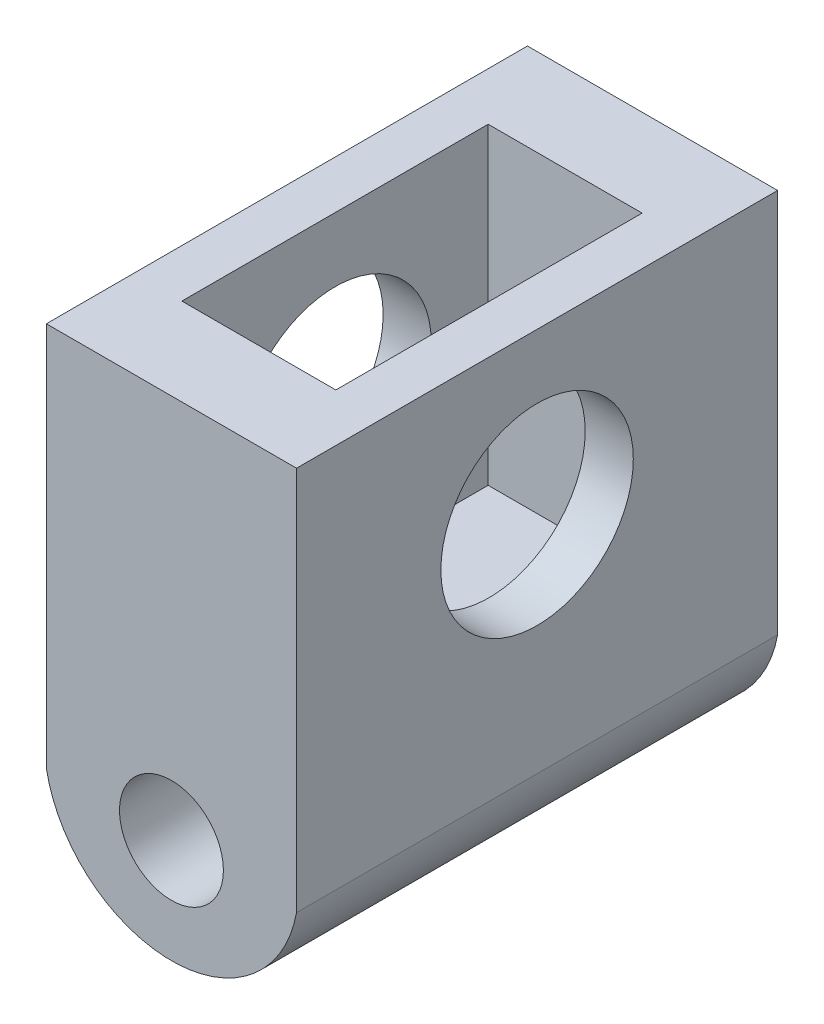
ISO-10303-21;
HEADER;
FILE_DESCRIPTION(('STEP AP214'),'2;1');
FILE_NAME('part.step','',(''),(''),'','','');
FILE_SCHEMA(('AUTOMOTIVE_DESIGN { 1 0 10303 214 1 1 1 1 }'));
ENDSEC;
DATA;
#1=APPLICATION_CONTEXT('core data for automotive mechanical design processes');
#2=APPLICATION_PROTOCOL_DEFINITION('international standard','automotive_design',2000,#1);
#3=PRODUCT_CONTEXT('',#1,'mechanical');
#4=PRODUCT('Part','Part','',(#3));
#5=PRODUCT_RELATED_PRODUCT_CATEGORY('part','',(#4));
#6=PRODUCT_DEFINITION_FORMATION('','',#4);
#7=PRODUCT_DEFINITION_CONTEXT('part definition',#1,'design');
#8=PRODUCT_DEFINITION('design','',#6,#7);
#9=PRODUCT_DEFINITION_SHAPE('','',#8);
#10=(LENGTH_UNIT() NAMED_UNIT(*) SI_UNIT(.MILLI.,.METRE.));
#11=(NAMED_UNIT(*) PLANE_ANGLE_UNIT() SI_UNIT($,.RADIAN.));
#12=(NAMED_UNIT(*) SI_UNIT($,.STERADIAN.) SOLID_ANGLE_UNIT());
#13=UNCERTAINTY_MEASURE_WITH_UNIT(LENGTH_MEASURE(1.E-05),#10,'distance_accuracy_value','');
#14=(GEOMETRIC_REPRESENTATION_CONTEXT(3) GLOBAL_UNCERTAINTY_ASSIGNED_CONTEXT((#13)) GLOBAL_UNIT_ASSIGNED_CONTEXT((#10,
#11,#12)) REPRESENTATION_CONTEXT('',''));
#15=CARTESIAN_POINT('',(0.,0.,0.));
#16=DIRECTION('',(0.,0.,1.));
#17=DIRECTION('',(1.,0.,0.));
#18=AXIS2_PLACEMENT_3D('',#15,#16,#17);
#19=CARTESIAN_POINT('',(0.,1.43,-15.));
#20=DIRECTION('',(0.,0.,1.));
#21=DIRECTION('',(1.,0.,0.));
#22=AXIS2_PLACEMENT_3D('',#19,#20,#21);
#23=CYLINDRICAL_SURFACE('',#22,7.93);
#24=DIRECTION('',(0.,0.,1.));
#25=VECTOR('',#24,1.);
#26=CARTESIAN_POINT('',(7.8,0.,-15.));
#27=LINE('',#26,#25);
#28=CARTESIAN_POINT('',(7.8,0.,-15.));
#29=VERTEX_POINT('',#28);
#30=CARTESIAN_POINT('',(7.8,0.,15.));
#31=VERTEX_POINT('',#30);
#32=EDGE_CURVE('E189',#29,#31,#27,.T.);
#33=ORIENTED_EDGE('',*,*,#32,.T.);
#34=CARTESIAN_POINT('',(0.,1.43,15.));
#35=DIRECTION('',(0.,0.,1.));
#36=DIRECTION('',(-1.,0.,0.));
#37=AXIS2_PLACEMENT_3D('',#34,#35,#36);
#38=CIRCLE('',#37,7.93);
#39=CARTESIAN_POINT('',(-7.8,0.,15.));
#40=VERTEX_POINT('',#39);
#41=EDGE_CURVE('E155',#40,#31,#38,.T.);
#42=ORIENTED_EDGE('',*,*,#41,.F.);
#43=DIRECTION('',(0.,0.,1.));
#44=VECTOR('',#43,1.);
#45=CARTESIAN_POINT('',(-7.8,0.,-15.));
#46=LINE('',#45,#44);
#47=CARTESIAN_POINT('',(-7.8,0.,-15.));
#48=VERTEX_POINT('',#47);
#49=EDGE_CURVE('E12',#48,#40,#46,.T.);
#50=ORIENTED_EDGE('',*,*,#49,.F.);
#51=CARTESIAN_POINT('',(0.,1.43,-15.));
#52=DIRECTION('',(0.,0.,1.));
#53=DIRECTION('',(-1.,0.,0.));
#54=AXIS2_PLACEMENT_3D('',#51,#52,#53);
#55=CIRCLE('',#54,7.93);
#56=EDGE_CURVE('E175',#48,#29,#55,.T.);
#57=ORIENTED_EDGE('',*,*,#56,.T.);
#58=EDGE_LOOP('',(#33,#42,#50,#57));
#59=FACE_BOUND('',#58,.T.);
#60=ADVANCED_FACE('F41',(#59),#23,.T.);
#61=CARTESIAN_POINT('',(-7.8,0.,-15.));
#62=DIRECTION('',(-1.,0.,0.));
#63=DIRECTION('',(0.,0.,1.));
#64=AXIS2_PLACEMENT_3D('',#61,#62,#63);
#65=PLANE('',#64);
#66=CARTESIAN_POINT('',(-7.8,14.,0.));
#67=DIRECTION('',(-1.,0.,0.));
#68=DIRECTION('',(0.,0.,1.));
#69=AXIS2_PLACEMENT_3D('',#66,#67,#68);
#70=CIRCLE('',#69,6.);
#71=CARTESIAN_POINT('',(-7.8,14.,6.));
#72=VERTEX_POINT('',#71);
#73=EDGE_CURVE('E346',#72,#72,#70,.T.);
#74=ORIENTED_EDGE('',*,*,#73,.F.);
#75=EDGE_LOOP('',(#74));
#76=FACE_BOUND('',#75,.T.);
#77=ORIENTED_EDGE('',*,*,#49,.T.);
#78=DIRECTION('',(0.,-1.,0.));
#79=VECTOR('',#78,1.);
#80=CARTESIAN_POINT('',(-7.8,0.,15.));
#81=LINE('',#80,#79);
#82=CARTESIAN_POINT('',(-7.8,24.,15.));
#83=VERTEX_POINT('',#82);
#84=EDGE_CURVE('E167',#83,#40,#81,.T.);
#85=ORIENTED_EDGE('',*,*,#84,.F.);
#86=DIRECTION('',(0.,0.,1.));
#87=VECTOR('',#86,1.);
#88=CARTESIAN_POINT('',(-7.8,24.,-15.));
#89=LINE('',#88,#87);
#90=CARTESIAN_POINT('',(-7.8,24.,-15.));
#91=VERTEX_POINT('',#90);
#92=EDGE_CURVE('E50',#91,#83,#89,.T.);
#93=ORIENTED_EDGE('',*,*,#92,.F.);
#94=DIRECTION('',(0.,-1.,0.));
#95=VECTOR('',#94,1.);
#96=CARTESIAN_POINT('',(-7.8,0.,-15.));
#97=LINE('',#96,#95);
#98=EDGE_CURVE('E186',#91,#48,#97,.T.);
#99=ORIENTED_EDGE('',*,*,#98,.T.);
#100=EDGE_LOOP('',(#77,#85,#93,#99));
#101=FACE_BOUND('',#100,.T.);
#102=ADVANCED_FACE('F206',(#76,#101),#65,.T.);
#103=CARTESIAN_POINT('',(-7.8,24.,-15.));
#104=DIRECTION('',(0.,1.,0.));
#105=DIRECTION('',(-1.,0.,0.));
#106=AXIS2_PLACEMENT_3D('',#103,#104,#105);
#107=PLANE('',#106);
#108=DIRECTION('',(-1.,0.,0.));
#109=VECTOR('',#108,1.);
#110=CARTESIAN_POINT('',(35.0957872207416,24.,9.55));
#111=LINE('',#110,#109);
#112=CARTESIAN_POINT('',(4.8,24.,9.55));
#113=VERTEX_POINT('',#112);
#114=CARTESIAN_POINT('',(-4.8,24.,9.55));
#115=VERTEX_POINT('',#114);
#116=EDGE_CURVE('E113',#113,#115,#111,.T.);
#117=ORIENTED_EDGE('',*,*,#116,.T.);
#118=DIRECTION('',(0.,0.,-1.));
#119=VECTOR('',#118,1.);
#120=CARTESIAN_POINT('',(-4.8,24.,-9.55));
#121=LINE('',#120,#119);
#122=CARTESIAN_POINT('',(-4.8,24.,-9.55));
#123=VERTEX_POINT('',#122);
#124=EDGE_CURVE('E129',#115,#123,#121,.T.);
#125=ORIENTED_EDGE('',*,*,#124,.T.);
#126=DIRECTION('',(-1.,0.,0.));
#127=VECTOR('',#126,1.);
#128=CARTESIAN_POINT('',(35.0957872207416,24.,-9.55));
#129=LINE('',#128,#127);
#130=CARTESIAN_POINT('',(4.8,24.,-9.55));
#131=VERTEX_POINT('',#130);
#132=EDGE_CURVE('E142',#131,#123,#129,.T.);
#133=ORIENTED_EDGE('',*,*,#132,.F.);
#134=DIRECTION('',(0.,0.,-1.));
#135=VECTOR('',#134,1.);
#136=CARTESIAN_POINT('',(4.8,24.,-9.55));
#137=LINE('',#136,#135);
#138=EDGE_CURVE('E58',#113,#131,#137,.T.);
#139=ORIENTED_EDGE('',*,*,#138,.F.);
#140=EDGE_LOOP('',(#117,#125,#133,#139));
#141=FACE_BOUND('',#140,.T.);
#142=ORIENTED_EDGE('',*,*,#92,.T.);
#143=DIRECTION('',(-1.,0.,0.));
#144=VECTOR('',#143,1.);
#145=CARTESIAN_POINT('',(-7.8,24.,15.));
#146=LINE('',#145,#144);
#147=CARTESIAN_POINT('',(7.8,24.,15.));
#148=VERTEX_POINT('',#147);
#149=EDGE_CURVE('E163',#148,#83,#146,.T.);
#150=ORIENTED_EDGE('',*,*,#149,.F.);
#151=DIRECTION('',(0.,0.,1.));
#152=VECTOR('',#151,1.);
#153=CARTESIAN_POINT('',(7.8,24.,-15.));
#154=LINE('',#153,#152);
#155=CARTESIAN_POINT('',(7.8,24.,-15.));
#156=VERTEX_POINT('',#155);
#157=EDGE_CURVE('E193',#156,#148,#154,.T.);
#158=ORIENTED_EDGE('',*,*,#157,.F.);
#159=DIRECTION('',(-1.,0.,0.));
#160=VECTOR('',#159,1.);
#161=CARTESIAN_POINT('',(-7.8,24.,-15.));
#162=LINE('',#161,#160);
#163=EDGE_CURVE('E182',#156,#91,#162,.T.);
#164=ORIENTED_EDGE('',*,*,#163,.T.);
#165=EDGE_LOOP('',(#142,#150,#158,#164));
#166=FACE_BOUND('',#165,.T.);
#167=ADVANCED_FACE('F212',(#141,#166),#107,.T.);
#168=CARTESIAN_POINT('',(7.8,0.,-15.));
#169=DIRECTION('',(1.,0.,0.));
#170=DIRECTION('',(0.,0.,-1.));
#171=AXIS2_PLACEMENT_3D('',#168,#169,#170);
#172=PLANE('',#171);
#173=CARTESIAN_POINT('',(7.8,14.,0.));
#174=DIRECTION('',(-1.,0.,0.));
#175=DIRECTION('',(0.,0.,1.));
#176=AXIS2_PLACEMENT_3D('',#173,#174,#175);
#177=CIRCLE('',#176,6.);
#178=CARTESIAN_POINT('',(7.8,14.,6.));
#179=VERTEX_POINT('',#178);
#180=EDGE_CURVE('E359',#179,#179,#177,.T.);
#181=ORIENTED_EDGE('',*,*,#180,.T.);
#182=EDGE_LOOP('',(#181));
#183=FACE_BOUND('',#182,.T.);
#184=ORIENTED_EDGE('',*,*,#157,.T.);
#185=DIRECTION('',(0.,1.,0.));
#186=VECTOR('',#185,1.);
#187=CARTESIAN_POINT('',(7.8,0.,15.));
#188=LINE('',#187,#186);
#189=EDGE_CURVE('E159',#31,#148,#188,.T.);
#190=ORIENTED_EDGE('',*,*,#189,.F.);
#191=ORIENTED_EDGE('',*,*,#32,.F.);
#192=DIRECTION('',(0.,1.,0.));
#193=VECTOR('',#192,1.);
#194=CARTESIAN_POINT('',(7.8,0.,-15.));
#195=LINE('',#194,#193);
#196=EDGE_CURVE('E178',#29,#156,#195,.T.);
#197=ORIENTED_EDGE('',*,*,#196,.T.);
#198=EDGE_LOOP('',(#184,#190,#191,#197));
#199=FACE_BOUND('',#198,.T.);
#200=ADVANCED_FACE('F199',(#183,#199),#172,.T.);
#201=CARTESIAN_POINT('',(0.,1.43,-15.));
#202=DIRECTION('',(0.,0.,-1.));
#203=DIRECTION('',(-1.,0.,0.));
#204=AXIS2_PLACEMENT_3D('',#201,#202,#203);
#205=PLANE('',#204);
#206=CARTESIAN_POINT('',(0.,0.,-15.));
#207=DIRECTION('',(0.,0.,1.));
#208=DIRECTION('',(1.,0.,0.));
#209=AXIS2_PLACEMENT_3D('',#206,#207,#208);
#210=CIRCLE('',#209,3.2385);
#211=CARTESIAN_POINT('',(3.2385,0.,-15.));
#212=VERTEX_POINT('',#211);
#213=EDGE_CURVE('E171',#212,#212,#210,.T.);
#214=ORIENTED_EDGE('',*,*,#213,.T.);
#215=EDGE_LOOP('',(#214));
#216=FACE_BOUND('',#215,.T.);
#217=ORIENTED_EDGE('',*,*,#56,.F.);
#218=ORIENTED_EDGE('',*,*,#98,.F.);
#219=ORIENTED_EDGE('',*,*,#163,.F.);
#220=ORIENTED_EDGE('',*,*,#196,.F.);
#221=EDGE_LOOP('',(#217,#218,#219,#220));
#222=FACE_BOUND('',#221,.T.);
#223=ADVANCED_FACE('F210',(#216,#222),#205,.T.);
#224=CARTESIAN_POINT('',(0.,0.,-15.));
#225=DIRECTION('',(0.,0.,1.));
#226=DIRECTION('',(1.,0.,0.));
#227=AXIS2_PLACEMENT_3D('',#224,#225,#226);
#228=CYLINDRICAL_SURFACE('',#227,3.2385);
#229=ORIENTED_EDGE('',*,*,#213,.F.);
#230=EDGE_LOOP('',(#229));
#231=FACE_BOUND('',#230,.T.);
#232=CARTESIAN_POINT('',(0.,0.,15.));
#233=DIRECTION('',(0.,0.,1.));
#234=DIRECTION('',(1.,0.,0.));
#235=AXIS2_PLACEMENT_3D('',#232,#233,#234);
#236=CIRCLE('',#235,3.2385);
#237=CARTESIAN_POINT('',(3.2385,0.,15.));
#238=VERTEX_POINT('',#237);
#239=EDGE_CURVE('E151',#238,#238,#236,.T.);
#240=ORIENTED_EDGE('',*,*,#239,.T.);
#241=EDGE_LOOP('',(#240));
#242=FACE_BOUND('',#241,.T.);
#243=ADVANCED_FACE('F301',(#231,#242),#228,.F.);
#244=CARTESIAN_POINT('',(0.,1.43,15.));
#245=DIRECTION('',(0.,0.,-1.));
#246=DIRECTION('',(-1.,0.,0.));
#247=AXIS2_PLACEMENT_3D('',#244,#245,#246);
#248=PLANE('',#247);
#249=ORIENTED_EDGE('',*,*,#41,.T.);
#250=ORIENTED_EDGE('',*,*,#189,.T.);
#251=ORIENTED_EDGE('',*,*,#149,.T.);
#252=ORIENTED_EDGE('',*,*,#84,.T.);
#253=EDGE_LOOP('',(#249,#250,#251,#252));
#254=FACE_BOUND('',#253,.T.);
#255=ORIENTED_EDGE('',*,*,#239,.F.);
#256=EDGE_LOOP('',(#255));
#257=FACE_BOUND('',#256,.T.);
#258=ADVANCED_FACE('F202',(#254,#257),#248,.F.);
#259=CARTESIAN_POINT('',(4.8,0.,-15.));
#260=DIRECTION('',(1.,0.,0.));
#261=DIRECTION('',(0.,0.,-1.));
#262=AXIS2_PLACEMENT_3D('',#259,#260,#261);
#263=PLANE('',#262);
#264=CARTESIAN_POINT('',(4.8,14.,0.));
#265=DIRECTION('',(1.,0.,0.));
#266=DIRECTION('',(0.,0.,-1.));
#267=AXIS2_PLACEMENT_3D('',#264,#265,#266);
#268=CIRCLE('',#267,6.);
#269=CARTESIAN_POINT('',(4.8,14.,-6.));
#270=VERTEX_POINT('',#269);
#271=EDGE_CURVE('E350',#270,#270,#268,.T.);
#272=ORIENTED_EDGE('',*,*,#271,.T.);
#273=EDGE_LOOP('',(#272));
#274=FACE_BOUND('',#273,.T.);
#275=DIRECTION('',(0.,-1.,0.));
#276=VECTOR('',#275,1.);
#277=CARTESIAN_POINT('',(4.8,24.,-9.55));
#278=LINE('',#277,#276);
#279=CARTESIAN_POINT('',(4.8,4.5,-9.55000000000001));
#280=VERTEX_POINT('',#279);
#281=EDGE_CURVE('E126',#131,#280,#278,.T.);
#282=ORIENTED_EDGE('',*,*,#281,.T.);
#283=DIRECTION('',(0.,0.,1.));
#284=VECTOR('',#283,1.);
#285=CARTESIAN_POINT('',(4.8,4.5,-9.55000000000001));
#286=LINE('',#285,#284);
#287=CARTESIAN_POINT('',(4.8,4.5,9.55));
#288=VERTEX_POINT('',#287);
#289=EDGE_CURVE('E120',#280,#288,#286,.T.);
#290=ORIENTED_EDGE('',*,*,#289,.T.);
#291=DIRECTION('',(0.,1.,0.));
#292=VECTOR('',#291,1.);
#293=CARTESIAN_POINT('',(4.8,24.,9.55));
#294=LINE('',#293,#292);
#295=EDGE_CURVE('E107',#288,#113,#294,.T.);
#296=ORIENTED_EDGE('',*,*,#295,.T.);
#297=ORIENTED_EDGE('',*,*,#138,.T.);
#298=EDGE_LOOP('',(#282,#290,#296,#297));
#299=FACE_BOUND('',#298,.T.);
#300=ADVANCED_FACE('F125',(#274,#299),#263,.F.);
#301=CARTESIAN_POINT('',(-4.8,0.,0.));
#302=DIRECTION('',(-1.,0.,0.));
#303=DIRECTION('',(0.,0.,1.));
#304=AXIS2_PLACEMENT_3D('',#301,#302,#303);
#305=PLANE('',#304);
#306=CARTESIAN_POINT('',(-4.8,14.,0.));
#307=DIRECTION('',(-1.,0.,0.));
#308=DIRECTION('',(0.,0.,1.));
#309=AXIS2_PLACEMENT_3D('',#306,#307,#308);
#310=CIRCLE('',#309,6.);
#311=CARTESIAN_POINT('',(-4.8,14.,6.));
#312=VERTEX_POINT('',#311);
#313=EDGE_CURVE('E44',#312,#312,#310,.T.);
#314=ORIENTED_EDGE('',*,*,#313,.T.);
#315=EDGE_LOOP('',(#314));
#316=FACE_BOUND('',#315,.T.);
#317=DIRECTION('',(0.,-1.,0.));
#318=VECTOR('',#317,1.);
#319=CARTESIAN_POINT('',(-4.8,24.,-9.55));
#320=LINE('',#319,#318);
#321=CARTESIAN_POINT('',(-4.8,4.5,-9.55000000000001));
#322=VERTEX_POINT('',#321);
#323=EDGE_CURVE('E137',#123,#322,#320,.T.);
#324=ORIENTED_EDGE('',*,*,#323,.F.);
#325=ORIENTED_EDGE('',*,*,#124,.F.);
#326=DIRECTION('',(0.,1.,0.));
#327=VECTOR('',#326,1.);
#328=CARTESIAN_POINT('',(-4.8,24.,9.55));
#329=LINE('',#328,#327);
#330=CARTESIAN_POINT('',(-4.8,4.5,9.55));
#331=VERTEX_POINT('',#330);
#332=EDGE_CURVE('E133',#331,#115,#329,.T.);
#333=ORIENTED_EDGE('',*,*,#332,.F.);
#334=DIRECTION('',(0.,0.,1.));
#335=VECTOR('',#334,1.);
#336=CARTESIAN_POINT('',(-4.8,4.5,-9.55000000000001));
#337=LINE('',#336,#335);
#338=EDGE_CURVE('E122',#322,#331,#337,.T.);
#339=ORIENTED_EDGE('',*,*,#338,.F.);
#340=EDGE_LOOP('',(#324,#325,#333,#339));
#341=FACE_BOUND('',#340,.T.);
#342=ADVANCED_FACE('F255',(#316,#341),#305,.F.);
#343=CARTESIAN_POINT('',(35.0957872207416,4.5,-9.55000000000001));
#344=DIRECTION('',(0.,-1.,0.));
#345=DIRECTION('',(0.,0.,-1.));
#346=AXIS2_PLACEMENT_3D('',#343,#344,#345);
#347=PLANE('',#346);
#348=DIRECTION('',(-1.,0.,0.));
#349=VECTOR('',#348,1.);
#350=CARTESIAN_POINT('',(35.0957872207416,4.5,-9.55000000000001));
#351=LINE('',#350,#349);
#352=EDGE_CURVE('E141',#280,#322,#351,.T.);
#353=ORIENTED_EDGE('',*,*,#352,.T.);
#354=ORIENTED_EDGE('',*,*,#338,.T.);
#355=DIRECTION('',(-1.,0.,0.));
#356=VECTOR('',#355,1.);
#357=CARTESIAN_POINT('',(35.0957872207416,4.5,9.55));
#358=LINE('',#357,#356);
#359=EDGE_CURVE('E110',#288,#331,#358,.T.);
#360=ORIENTED_EDGE('',*,*,#359,.F.);
#361=ORIENTED_EDGE('',*,*,#289,.F.);
#362=EDGE_LOOP('',(#353,#354,#360,#361));
#363=FACE_BOUND('',#362,.T.);
#364=ADVANCED_FACE('F119',(#363),#347,.F.);
#365=CARTESIAN_POINT('',(35.0957872207416,24.,9.55));
#366=DIRECTION('',(0.,0.,1.));
#367=DIRECTION('',(0.,-1.,0.));
#368=AXIS2_PLACEMENT_3D('',#365,#366,#367);
#369=PLANE('',#368);
#370=ORIENTED_EDGE('',*,*,#359,.T.);
#371=ORIENTED_EDGE('',*,*,#332,.T.);
#372=ORIENTED_EDGE('',*,*,#116,.F.);
#373=ORIENTED_EDGE('',*,*,#295,.F.);
#374=EDGE_LOOP('',(#370,#371,#372,#373));
#375=FACE_BOUND('',#374,.T.);
#376=ADVANCED_FACE('F109',(#375),#369,.F.);
#377=CARTESIAN_POINT('',(35.0957872207416,24.,-9.55));
#378=DIRECTION('',(0.,0.,-1.));
#379=DIRECTION('',(0.,1.,0.));
#380=AXIS2_PLACEMENT_3D('',#377,#378,#379);
#381=PLANE('',#380);
#382=ORIENTED_EDGE('',*,*,#132,.T.);
#383=ORIENTED_EDGE('',*,*,#323,.T.);
#384=ORIENTED_EDGE('',*,*,#352,.F.);
#385=ORIENTED_EDGE('',*,*,#281,.F.);
#386=EDGE_LOOP('',(#382,#383,#384,#385));
#387=FACE_BOUND('',#386,.T.);
#388=ADVANCED_FACE('F238',(#387),#381,.F.);
#389=CARTESIAN_POINT('',(7.8,14.,0.));
#390=DIRECTION('',(-1.,0.,0.));
#391=DIRECTION('',(0.,0.,1.));
#392=AXIS2_PLACEMENT_3D('',#389,#390,#391);
#393=CYLINDRICAL_SURFACE('',#392,6.);
#394=ORIENTED_EDGE('',*,*,#73,.T.);
#395=EDGE_LOOP('',(#394));
#396=FACE_BOUND('',#395,.T.);
#397=ORIENTED_EDGE('',*,*,#313,.F.);
#398=EDGE_LOOP('',(#397));
#399=FACE_BOUND('',#398,.T.);
#400=ADVANCED_FACE('F274',(#396,#399),#393,.F.);
#401=ORIENTED_EDGE('',*,*,#180,.F.);
#402=EDGE_LOOP('',(#401));
#403=FACE_BOUND('',#402,.T.);
#404=ORIENTED_EDGE('',*,*,#271,.F.);
#405=EDGE_LOOP('',(#404));
#406=FACE_BOUND('',#405,.T.);
#407=ADVANCED_FACE('F279',(#403,#406),#393,.F.);
#408=CLOSED_SHELL('',(#60,#102,#167,#200,#223,#243,#258,#300,#342,#364,#376,#388,#400,#407));
#409=MANIFOLD_SOLID_BREP('B2',#408);
#410=ADVANCED_BREP_SHAPE_REPRESENTATION('',(#18,#409),#14);
#411=SHAPE_DEFINITION_REPRESENTATION(#9,#410);
ENDSEC;
END-ISO-10303-21;
